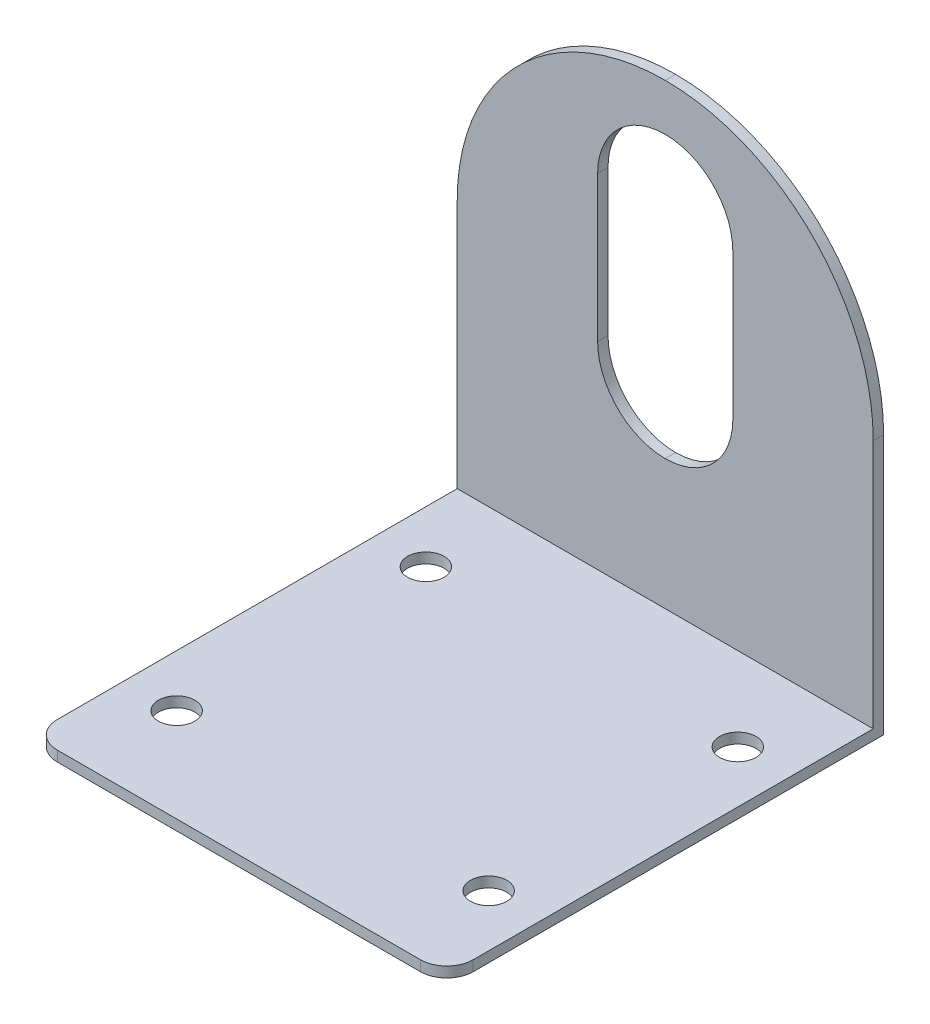
ISO-10303-21;
HEADER;
FILE_DESCRIPTION(('STEP AP214'),'2;1');
FILE_NAME('part.step','',(''),(''),'','','');
FILE_SCHEMA(('AUTOMOTIVE_DESIGN { 1 0 10303 214 1 1 1 1 }'));
ENDSEC;
DATA;
#1=APPLICATION_CONTEXT('core data for automotive mechanical design processes');
#2=APPLICATION_PROTOCOL_DEFINITION('international standard','automotive_design',2000,#1);
#3=PRODUCT_CONTEXT('',#1,'mechanical');
#4=PRODUCT('Part','Part','',(#3));
#5=PRODUCT_RELATED_PRODUCT_CATEGORY('part','',(#4));
#6=PRODUCT_DEFINITION_FORMATION('','',#4);
#7=PRODUCT_DEFINITION_CONTEXT('part definition',#1,'design');
#8=PRODUCT_DEFINITION('design','',#6,#7);
#9=PRODUCT_DEFINITION_SHAPE('','',#8);
#10=(LENGTH_UNIT() NAMED_UNIT(*) SI_UNIT(.MILLI.,.METRE.));
#11=(NAMED_UNIT(*) PLANE_ANGLE_UNIT() SI_UNIT($,.RADIAN.));
#12=(NAMED_UNIT(*) SI_UNIT($,.STERADIAN.) SOLID_ANGLE_UNIT());
#13=UNCERTAINTY_MEASURE_WITH_UNIT(LENGTH_MEASURE(1.E-05),#10,'distance_accuracy_value','');
#14=(GEOMETRIC_REPRESENTATION_CONTEXT(3) GLOBAL_UNCERTAINTY_ASSIGNED_CONTEXT((#13)) GLOBAL_UNIT_ASSIGNED_CONTEXT((#10,
#11,#12)) REPRESENTATION_CONTEXT('',''));
#15=CARTESIAN_POINT('',(0.,0.,0.));
#16=DIRECTION('',(0.,0.,1.));
#17=DIRECTION('',(1.,0.,0.));
#18=AXIS2_PLACEMENT_3D('',#15,#16,#17);
#19=CARTESIAN_POINT('',(20.,20.,42.));
#20=DIRECTION('',(0.,0.,1.));
#21=DIRECTION('',(1.,0.,0.));
#22=AXIS2_PLACEMENT_3D('',#19,#20,#21);
#23=CYLINDRICAL_SURFACE('',#22,6.5);
#24=DIRECTION('',(0.,0.,-1.));
#25=VECTOR('',#24,1.);
#26=CARTESIAN_POINT('',(26.5,20.,42.));
#27=LINE('',#26,#25);
#28=CARTESIAN_POINT('',(26.5,20.,0.));
#29=VERTEX_POINT('',#28);
#30=CARTESIAN_POINT('',(26.5,20.,1.));
#31=VERTEX_POINT('',#30);
#32=EDGE_CURVE('E251',#29,#31,#27,.F.);
#33=ORIENTED_EDGE('',*,*,#32,.F.);
#34=CARTESIAN_POINT('',(20.,20.,0.));
#35=DIRECTION('',(0.,0.,-1.));
#36=DIRECTION('',(-1.,0.,0.));
#37=AXIS2_PLACEMENT_3D('',#34,#35,#36);
#38=CIRCLE('',#37,6.5);
#39=CARTESIAN_POINT('',(20.,13.5,0.));
#40=VERTEX_POINT('',#39);
#41=EDGE_CURVE('E11',#29,#40,#38,.T.);
#42=ORIENTED_EDGE('',*,*,#41,.T.);
#43=DIRECTION('',(0.,0.,-1.));
#44=VECTOR('',#43,1.);
#45=CARTESIAN_POINT('',(20.,13.5,42.));
#46=LINE('',#45,#44);
#47=CARTESIAN_POINT('',(20.,13.5,1.));
#48=VERTEX_POINT('',#47);
#49=EDGE_CURVE('E244',#40,#48,#46,.F.);
#50=ORIENTED_EDGE('',*,*,#49,.T.);
#51=CARTESIAN_POINT('',(20.,20.,1.));
#52=DIRECTION('',(0.,0.,-1.));
#53=DIRECTION('',(-1.,0.,0.));
#54=AXIS2_PLACEMENT_3D('',#51,#52,#53);
#55=CIRCLE('',#54,6.5);
#56=EDGE_CURVE('E40',#48,#31,#55,.F.);
#57=ORIENTED_EDGE('',*,*,#56,.T.);
#58=EDGE_LOOP('',(#33,#42,#50,#57));
#59=FACE_BOUND('',#58,.T.);
#60=ADVANCED_FACE('F33',(#59),#23,.F.);
#61=CARTESIAN_POINT('',(20.,20.,42.));
#62=DIRECTION('',(0.,0.,1.));
#63=DIRECTION('',(1.,0.,0.));
#64=AXIS2_PLACEMENT_3D('',#61,#62,#63);
#65=CYLINDRICAL_SURFACE('',#64,6.5);
#66=DIRECTION('',(0.,0.,-1.));
#67=VECTOR('',#66,1.);
#68=CARTESIAN_POINT('',(13.5,20.,42.));
#69=LINE('',#68,#67);
#70=CARTESIAN_POINT('',(13.5,20.,1.));
#71=VERTEX_POINT('',#70);
#72=CARTESIAN_POINT('',(13.5,20.,0.));
#73=VERTEX_POINT('',#72);
#74=EDGE_CURVE('E241',#71,#73,#69,.T.);
#75=ORIENTED_EDGE('',*,*,#74,.F.);
#76=CARTESIAN_POINT('',(20.,20.,1.));
#77=DIRECTION('',(0.,0.,-1.));
#78=DIRECTION('',(-1.,0.,0.));
#79=AXIS2_PLACEMENT_3D('',#76,#77,#78);
#80=CIRCLE('',#79,6.5);
#81=EDGE_CURVE('E246',#71,#48,#80,.F.);
#82=ORIENTED_EDGE('',*,*,#81,.T.);
#83=ORIENTED_EDGE('',*,*,#49,.F.);
#84=CARTESIAN_POINT('',(20.,20.,0.));
#85=DIRECTION('',(0.,0.,-1.));
#86=DIRECTION('',(-1.,0.,0.));
#87=AXIS2_PLACEMENT_3D('',#84,#85,#86);
#88=CIRCLE('',#87,6.5);
#89=EDGE_CURVE('E249',#40,#73,#88,.T.);
#90=ORIENTED_EDGE('',*,*,#89,.T.);
#91=EDGE_LOOP('',(#75,#82,#83,#90));
#92=FACE_BOUND('',#91,.T.);
#93=ADVANCED_FACE('F309',(#92),#65,.F.);
#94=CARTESIAN_POINT('',(20.,34.,42.));
#95=DIRECTION('',(0.,0.,-1.));
#96=DIRECTION('',(-1.,0.,0.));
#97=AXIS2_PLACEMENT_3D('',#94,#95,#96);
#98=CYLINDRICAL_SURFACE('',#97,6.5);
#99=DIRECTION('',(0.,0.,1.));
#100=VECTOR('',#99,1.);
#101=CARTESIAN_POINT('',(26.5,34.,42.));
#102=LINE('',#101,#100);
#103=CARTESIAN_POINT('',(26.5,34.,1.));
#104=VERTEX_POINT('',#103);
#105=CARTESIAN_POINT('',(26.5,34.,0.));
#106=VERTEX_POINT('',#105);
#107=EDGE_CURVE('E234',#104,#106,#102,.F.);
#108=ORIENTED_EDGE('',*,*,#107,.F.);
#109=CARTESIAN_POINT('',(20.,34.,1.));
#110=DIRECTION('',(0.,0.,-1.));
#111=DIRECTION('',(-1.,0.,0.));
#112=AXIS2_PLACEMENT_3D('',#109,#110,#111);
#113=CIRCLE('',#112,6.5);
#114=CARTESIAN_POINT('',(20.,40.5,1.));
#115=VERTEX_POINT('',#114);
#116=EDGE_CURVE('E239',#104,#115,#113,.F.);
#117=ORIENTED_EDGE('',*,*,#116,.T.);
#118=DIRECTION('',(0.,0.,-1.));
#119=VECTOR('',#118,1.);
#120=CARTESIAN_POINT('',(20.,40.5,42.));
#121=LINE('',#120,#119);
#122=CARTESIAN_POINT('',(20.,40.5,0.));
#123=VERTEX_POINT('',#122);
#124=EDGE_CURVE('E222',#115,#123,#121,.T.);
#125=ORIENTED_EDGE('',*,*,#124,.T.);
#126=CARTESIAN_POINT('',(20.,34.,0.));
#127=DIRECTION('',(0.,0.,-1.));
#128=DIRECTION('',(-1.,0.,0.));
#129=AXIS2_PLACEMENT_3D('',#126,#127,#128);
#130=CIRCLE('',#129,6.5);
#131=EDGE_CURVE('E237',#123,#106,#130,.T.);
#132=ORIENTED_EDGE('',*,*,#131,.T.);
#133=EDGE_LOOP('',(#108,#117,#125,#132));
#134=FACE_BOUND('',#133,.T.);
#135=ADVANCED_FACE('F313',(#134),#98,.F.);
#136=CARTESIAN_POINT('',(20.,34.,42.));
#137=DIRECTION('',(0.,0.,1.));
#138=DIRECTION('',(1.,0.,0.));
#139=AXIS2_PLACEMENT_3D('',#136,#137,#138);
#140=CYLINDRICAL_SURFACE('',#139,6.5);
#141=ORIENTED_EDGE('',*,*,#124,.F.);
#142=CARTESIAN_POINT('',(20.,34.,1.));
#143=DIRECTION('',(0.,0.,-1.));
#144=DIRECTION('',(-1.,0.,0.));
#145=AXIS2_PLACEMENT_3D('',#142,#143,#144);
#146=CIRCLE('',#145,6.5);
#147=CARTESIAN_POINT('',(13.5,34.,1.));
#148=VERTEX_POINT('',#147);
#149=EDGE_CURVE('E228',#115,#148,#146,.F.);
#150=ORIENTED_EDGE('',*,*,#149,.T.);
#151=DIRECTION('',(0.,0.,-1.));
#152=VECTOR('',#151,1.);
#153=CARTESIAN_POINT('',(13.5,34.,42.));
#154=LINE('',#153,#152);
#155=CARTESIAN_POINT('',(13.5,34.,0.));
#156=VERTEX_POINT('',#155);
#157=EDGE_CURVE('E225',#156,#148,#154,.F.);
#158=ORIENTED_EDGE('',*,*,#157,.F.);
#159=CARTESIAN_POINT('',(20.,34.,0.));
#160=DIRECTION('',(0.,0.,-1.));
#161=DIRECTION('',(-1.,0.,0.));
#162=AXIS2_PLACEMENT_3D('',#159,#160,#161);
#163=CIRCLE('',#162,6.5);
#164=EDGE_CURVE('E231',#156,#123,#163,.T.);
#165=ORIENTED_EDGE('',*,*,#164,.T.);
#166=EDGE_LOOP('',(#141,#150,#158,#165));
#167=FACE_BOUND('',#166,.T.);
#168=ADVANCED_FACE('F318',(#167),#140,.F.);
#169=CARTESIAN_POINT('',(2.54,0.,39.46));
#170=DIRECTION('',(0.,1.,0.));
#171=DIRECTION('',(0.,0.,1.));
#172=AXIS2_PLACEMENT_3D('',#169,#170,#171);
#173=CYLINDRICAL_SURFACE('',#172,2.54);
#174=DIRECTION('',(0.,1.,0.));
#175=VECTOR('',#174,1.);
#176=CARTESIAN_POINT('',(0.,0.,39.46));
#177=LINE('',#176,#175);
#178=CARTESIAN_POINT('',(0.,0.,39.46));
#179=VERTEX_POINT('',#178);
#180=CARTESIAN_POINT('',(0.,1.,39.46));
#181=VERTEX_POINT('',#180);
#182=EDGE_CURVE('E145',#179,#181,#177,.T.);
#183=ORIENTED_EDGE('',*,*,#182,.F.);
#184=CARTESIAN_POINT('',(2.54,0.,39.46));
#185=DIRECTION('',(0.,1.,0.));
#186=DIRECTION('',(0.,0.,1.));
#187=AXIS2_PLACEMENT_3D('',#184,#185,#186);
#188=CIRCLE('',#187,2.54);
#189=CARTESIAN_POINT('',(2.54,0.,42.));
#190=VERTEX_POINT('',#189);
#191=EDGE_CURVE('E218',#190,#179,#188,.F.);
#192=ORIENTED_EDGE('',*,*,#191,.F.);
#193=DIRECTION('',(0.,1.,0.));
#194=VECTOR('',#193,1.);
#195=CARTESIAN_POINT('',(2.54,0.,42.));
#196=LINE('',#195,#194);
#197=CARTESIAN_POINT('',(2.54,1.,42.));
#198=VERTEX_POINT('',#197);
#199=EDGE_CURVE('E215',#198,#190,#196,.F.);
#200=ORIENTED_EDGE('',*,*,#199,.F.);
#201=CARTESIAN_POINT('',(2.54,1.,39.46));
#202=DIRECTION('',(0.,-1.,0.));
#203=DIRECTION('',(0.,0.,-1.));
#204=AXIS2_PLACEMENT_3D('',#201,#202,#203);
#205=CIRCLE('',#204,2.54);
#206=EDGE_CURVE('E220',#181,#198,#205,.F.);
#207=ORIENTED_EDGE('',*,*,#206,.F.);
#208=EDGE_LOOP('',(#183,#192,#200,#207));
#209=FACE_BOUND('',#208,.T.);
#210=ADVANCED_FACE('F325',(#209),#173,.T.);
#211=CARTESIAN_POINT('',(37.46,0.,39.46));
#212=DIRECTION('',(0.,-1.,0.));
#213=DIRECTION('',(0.,0.,-1.));
#214=AXIS2_PLACEMENT_3D('',#211,#212,#213);
#215=CYLINDRICAL_SURFACE('',#214,2.54);
#216=DIRECTION('',(0.,-1.,0.));
#217=VECTOR('',#216,1.);
#218=CARTESIAN_POINT('',(40.,0.,39.46));
#219=LINE('',#218,#217);
#220=CARTESIAN_POINT('',(40.,1.,39.46));
#221=VERTEX_POINT('',#220);
#222=CARTESIAN_POINT('',(40.,0.,39.46));
#223=VERTEX_POINT('',#222);
#224=EDGE_CURVE('E203',#221,#223,#219,.T.);
#225=ORIENTED_EDGE('',*,*,#224,.F.);
#226=CARTESIAN_POINT('',(37.46,1.,39.46));
#227=DIRECTION('',(0.,-1.,0.));
#228=DIRECTION('',(0.,0.,-1.));
#229=AXIS2_PLACEMENT_3D('',#226,#227,#228);
#230=CIRCLE('',#229,2.54);
#231=CARTESIAN_POINT('',(37.46,1.,42.));
#232=VERTEX_POINT('',#231);
#233=EDGE_CURVE('E209',#232,#221,#230,.F.);
#234=ORIENTED_EDGE('',*,*,#233,.F.);
#235=DIRECTION('',(0.,-1.,0.));
#236=VECTOR('',#235,1.);
#237=CARTESIAN_POINT('',(37.46,0.,42.));
#238=LINE('',#237,#236);
#239=CARTESIAN_POINT('',(37.46,0.,42.));
#240=VERTEX_POINT('',#239);
#241=EDGE_CURVE('E206',#240,#232,#238,.F.);
#242=ORIENTED_EDGE('',*,*,#241,.F.);
#243=CARTESIAN_POINT('',(37.46,0.,39.46));
#244=DIRECTION('',(0.,1.,0.));
#245=DIRECTION('',(0.,0.,1.));
#246=AXIS2_PLACEMENT_3D('',#243,#244,#245);
#247=CIRCLE('',#246,2.54);
#248=EDGE_CURVE('E211',#223,#240,#247,.F.);
#249=ORIENTED_EDGE('',*,*,#248,.F.);
#250=EDGE_LOOP('',(#225,#234,#242,#249));
#251=FACE_BOUND('',#250,.T.);
#252=ADVANCED_FACE('F329',(#251),#215,.T.);
#253=CARTESIAN_POINT('',(0.,0.,1.));
#254=DIRECTION('',(0.,0.,-1.));
#255=DIRECTION('',(-1.,0.,0.));
#256=AXIS2_PLACEMENT_3D('',#253,#254,#255);
#257=PLANE('',#256);
#258=ORIENTED_EDGE('',*,*,#56,.F.);
#259=ORIENTED_EDGE('',*,*,#81,.F.);
#260=DIRECTION('',(0.,1.,0.));
#261=VECTOR('',#260,1.);
#262=CARTESIAN_POINT('',(13.5,0.,1.));
#263=LINE('',#262,#261);
#264=EDGE_CURVE('E262',#71,#148,#263,.T.);
#265=ORIENTED_EDGE('',*,*,#264,.T.);
#266=ORIENTED_EDGE('',*,*,#149,.F.);
#267=ORIENTED_EDGE('',*,*,#116,.F.);
#268=DIRECTION('',(0.,-1.,0.));
#269=VECTOR('',#268,1.);
#270=CARTESIAN_POINT('',(26.5,0.,1.));
#271=LINE('',#270,#269);
#272=EDGE_CURVE('E257',#104,#31,#271,.T.);
#273=ORIENTED_EDGE('',*,*,#272,.T.);
#274=EDGE_LOOP('',(#258,#259,#265,#266,#267,#273));
#275=FACE_BOUND('',#274,.T.);
#276=DIRECTION('',(-1.,0.,0.));
#277=VECTOR('',#276,1.);
#278=CARTESIAN_POINT('',(0.,1.,1.));
#279=LINE('',#278,#277);
#280=CARTESIAN_POINT('',(40.,1.,1.));
#281=VERTEX_POINT('',#280);
#282=CARTESIAN_POINT('',(0.,1.,1.));
#283=VERTEX_POINT('',#282);
#284=EDGE_CURVE('E154',#281,#283,#279,.T.);
#285=ORIENTED_EDGE('',*,*,#284,.F.);
#286=DIRECTION('',(0.,1.,0.));
#287=VECTOR('',#286,1.);
#288=CARTESIAN_POINT('',(40.,0.,1.));
#289=LINE('',#288,#287);
#290=CARTESIAN_POINT('',(40.,24.999999916,1.));
#291=VERTEX_POINT('',#290);
#292=EDGE_CURVE('E159',#281,#291,#289,.T.);
#293=ORIENTED_EDGE('',*,*,#292,.T.);
#294=CARTESIAN_POINT('',(20.,24.999999916,1.));
#295=DIRECTION('',(0.,0.,-1.));
#296=DIRECTION('',(-1.,0.,0.));
#297=AXIS2_PLACEMENT_3D('',#294,#295,#296);
#298=CIRCLE('',#297,20.);
#299=CARTESIAN_POINT('',(20.,44.999999916,1.));
#300=VERTEX_POINT('',#299);
#301=EDGE_CURVE('E199',#291,#300,#298,.F.);
#302=ORIENTED_EDGE('',*,*,#301,.T.);
#303=CARTESIAN_POINT('',(20.,24.999999916,1.));
#304=DIRECTION('',(0.,0.,-1.));
#305=DIRECTION('',(-1.,0.,0.));
#306=AXIS2_PLACEMENT_3D('',#303,#304,#305);
#307=CIRCLE('',#306,20.);
#308=CARTESIAN_POINT('',(0.,24.999999916,1.));
#309=VERTEX_POINT('',#308);
#310=EDGE_CURVE('E157',#300,#309,#307,.F.);
#311=ORIENTED_EDGE('',*,*,#310,.T.);
#312=DIRECTION('',(0.,-1.,0.));
#313=VECTOR('',#312,1.);
#314=CARTESIAN_POINT('',(0.,0.,1.));
#315=LINE('',#314,#313);
#316=EDGE_CURVE('E143',#309,#283,#315,.T.);
#317=ORIENTED_EDGE('',*,*,#316,.T.);
#318=EDGE_LOOP('',(#285,#293,#302,#311,#317));
#319=FACE_BOUND('',#318,.T.);
#320=ADVANCED_FACE('F153',(#275,#319),#257,.F.);
#321=CARTESIAN_POINT('',(20.,24.999999916,1.));
#322=DIRECTION('',(0.,0.,-1.));
#323=DIRECTION('',(-1.,0.,0.));
#324=AXIS2_PLACEMENT_3D('',#321,#322,#323);
#325=CYLINDRICAL_SURFACE('',#324,20.);
#326=DIRECTION('',(0.,0.,-1.));
#327=VECTOR('',#326,1.);
#328=CARTESIAN_POINT('',(20.,44.999999916,1.));
#329=LINE('',#328,#327);
#330=CARTESIAN_POINT('',(20.,44.999999916,0.));
#331=VERTEX_POINT('',#330);
#332=EDGE_CURVE('E189',#331,#300,#329,.F.);
#333=ORIENTED_EDGE('',*,*,#332,.T.);
#334=ORIENTED_EDGE('',*,*,#301,.F.);
#335=DIRECTION('',(0.,0.,-1.));
#336=VECTOR('',#335,1.);
#337=CARTESIAN_POINT('',(40.,24.999999916,1.));
#338=LINE('',#337,#336);
#339=CARTESIAN_POINT('',(40.,24.999999916,0.));
#340=VERTEX_POINT('',#339);
#341=EDGE_CURVE('E196',#340,#291,#338,.F.);
#342=ORIENTED_EDGE('',*,*,#341,.F.);
#343=CARTESIAN_POINT('',(20.,24.999999916,0.));
#344=DIRECTION('',(0.,0.,-1.));
#345=DIRECTION('',(-1.,0.,0.));
#346=AXIS2_PLACEMENT_3D('',#343,#344,#345);
#347=CIRCLE('',#346,20.);
#348=EDGE_CURVE('E201',#331,#340,#347,.T.);
#349=ORIENTED_EDGE('',*,*,#348,.F.);
#350=EDGE_LOOP('',(#333,#334,#342,#349));
#351=FACE_BOUND('',#350,.T.);
#352=ADVANCED_FACE('F334',(#351),#325,.T.);
#353=CARTESIAN_POINT('',(20.,24.999999916,1.));
#354=DIRECTION('',(0.,0.,-1.));
#355=DIRECTION('',(-1.,0.,0.));
#356=AXIS2_PLACEMENT_3D('',#353,#354,#355);
#357=CYLINDRICAL_SURFACE('',#356,20.);
#358=DIRECTION('',(0.,0.,-1.));
#359=VECTOR('',#358,1.);
#360=CARTESIAN_POINT('',(0.,24.999999916,1.));
#361=LINE('',#360,#359);
#362=CARTESIAN_POINT('',(0.,24.999999916,0.));
#363=VERTEX_POINT('',#362);
#364=EDGE_CURVE('E187',#309,#363,#361,.T.);
#365=ORIENTED_EDGE('',*,*,#364,.F.);
#366=ORIENTED_EDGE('',*,*,#310,.F.);
#367=ORIENTED_EDGE('',*,*,#332,.F.);
#368=CARTESIAN_POINT('',(20.,24.999999916,0.));
#369=DIRECTION('',(0.,0.,-1.));
#370=DIRECTION('',(-1.,0.,0.));
#371=AXIS2_PLACEMENT_3D('',#368,#369,#370);
#372=CIRCLE('',#371,20.);
#373=EDGE_CURVE('E193',#363,#331,#372,.T.);
#374=ORIENTED_EDGE('',*,*,#373,.F.);
#375=EDGE_LOOP('',(#365,#366,#367,#374));
#376=FACE_BOUND('',#375,.T.);
#377=ADVANCED_FACE('F337',(#376),#357,.T.);
#378=CARTESIAN_POINT('',(0.,0.,1.));
#379=DIRECTION('',(1.,0.,0.));
#380=DIRECTION('',(0.,0.,-1.));
#381=AXIS2_PLACEMENT_3D('',#378,#379,#380);
#382=PLANE('',#381);
#383=DIRECTION('',(0.,0.,-1.));
#384=VECTOR('',#383,1.);
#385=CARTESIAN_POINT('',(0.,0.,1.));
#386=LINE('',#385,#384);
#387=CARTESIAN_POINT('',(0.,0.,0.));
#388=VERTEX_POINT('',#387);
#389=EDGE_CURVE('E185',#179,#388,#386,.T.);
#390=ORIENTED_EDGE('',*,*,#389,.F.);
#391=ORIENTED_EDGE('',*,*,#182,.T.);
#392=DIRECTION('',(0.,0.,-1.));
#393=VECTOR('',#392,1.);
#394=CARTESIAN_POINT('',(0.,1.,42.));
#395=LINE('',#394,#393);
#396=EDGE_CURVE('E138',#181,#283,#395,.T.);
#397=ORIENTED_EDGE('',*,*,#396,.T.);
#398=ORIENTED_EDGE('',*,*,#316,.F.);
#399=ORIENTED_EDGE('',*,*,#364,.T.);
#400=DIRECTION('',(0.,-1.,0.));
#401=VECTOR('',#400,1.);
#402=CARTESIAN_POINT('',(0.,0.,0.));
#403=LINE('',#402,#401);
#404=EDGE_CURVE('E173',#363,#388,#403,.T.);
#405=ORIENTED_EDGE('',*,*,#404,.T.);
#406=EDGE_LOOP('',(#390,#391,#397,#398,#399,#405));
#407=FACE_BOUND('',#406,.T.);
#408=ADVANCED_FACE('F141',(#407),#382,.F.);
#409=CARTESIAN_POINT('',(0.,0.,1.));
#410=DIRECTION('',(0.,1.,0.));
#411=DIRECTION('',(0.,0.,1.));
#412=AXIS2_PLACEMENT_3D('',#409,#410,#411);
#413=PLANE('',#412);
#414=CARTESIAN_POINT('',(35.,0.,9.02029299449192));
#415=DIRECTION('',(0.,1.,0.));
#416=DIRECTION('',(0.,0.,1.));
#417=AXIS2_PLACEMENT_3D('',#414,#415,#416);
#418=CIRCLE('',#417,1.75);
#419=CARTESIAN_POINT('',(35.,0.,10.7702929944919));
#420=VERTEX_POINT('',#419);
#421=EDGE_CURVE('E282',#420,#420,#418,.T.);
#422=ORIENTED_EDGE('',*,*,#421,.T.);
#423=EDGE_LOOP('',(#422));
#424=FACE_BOUND('',#423,.T.);
#425=CARTESIAN_POINT('',(5.,0.,9.02029299449192));
#426=DIRECTION('',(0.,1.,0.));
#427=DIRECTION('',(0.,0.,1.));
#428=AXIS2_PLACEMENT_3D('',#425,#426,#427);
#429=CIRCLE('',#428,1.75);
#430=CARTESIAN_POINT('',(5.,0.,10.7702929944919));
#431=VERTEX_POINT('',#430);
#432=EDGE_CURVE('E276',#431,#431,#429,.T.);
#433=ORIENTED_EDGE('',*,*,#432,.T.);
#434=EDGE_LOOP('',(#433));
#435=FACE_BOUND('',#434,.T.);
#436=CARTESIAN_POINT('',(5.,0.,32.9797070055081));
#437=DIRECTION('',(0.,1.,0.));
#438=DIRECTION('',(0.,0.,1.));
#439=AXIS2_PLACEMENT_3D('',#436,#437,#438);
#440=CIRCLE('',#439,1.75);
#441=CARTESIAN_POINT('',(5.,0.,34.7297070055081));
#442=VERTEX_POINT('',#441);
#443=EDGE_CURVE('E270',#442,#442,#440,.T.);
#444=ORIENTED_EDGE('',*,*,#443,.T.);
#445=EDGE_LOOP('',(#444));
#446=FACE_BOUND('',#445,.T.);
#447=CARTESIAN_POINT('',(35.,0.,32.9797070055081));
#448=DIRECTION('',(0.,1.,0.));
#449=DIRECTION('',(0.,0.,1.));
#450=AXIS2_PLACEMENT_3D('',#447,#448,#449);
#451=CIRCLE('',#450,1.75);
#452=CARTESIAN_POINT('',(35.,0.,34.7297070055081));
#453=VERTEX_POINT('',#452);
#454=EDGE_CURVE('E165',#453,#453,#451,.T.);
#455=ORIENTED_EDGE('',*,*,#454,.T.);
#456=EDGE_LOOP('',(#455));
#457=FACE_BOUND('',#456,.T.);
#458=DIRECTION('',(1.,0.,0.));
#459=VECTOR('',#458,1.);
#460=CARTESIAN_POINT('',(0.,0.,42.));
#461=LINE('',#460,#459);
#462=EDGE_CURVE('E164',#190,#240,#461,.T.);
#463=ORIENTED_EDGE('',*,*,#462,.F.);
#464=ORIENTED_EDGE('',*,*,#191,.T.);
#465=ORIENTED_EDGE('',*,*,#389,.T.);
#466=DIRECTION('',(1.,0.,0.));
#467=VECTOR('',#466,1.);
#468=CARTESIAN_POINT('',(0.,0.,0.));
#469=LINE('',#468,#467);
#470=CARTESIAN_POINT('',(40.,0.,0.));
#471=VERTEX_POINT('',#470);
#472=EDGE_CURVE('E179',#388,#471,#469,.T.);
#473=ORIENTED_EDGE('',*,*,#472,.T.);
#474=DIRECTION('',(0.,0.,-1.));
#475=VECTOR('',#474,1.);
#476=CARTESIAN_POINT('',(40.,0.,1.));
#477=LINE('',#476,#475);
#478=EDGE_CURVE('E176',#223,#471,#477,.T.);
#479=ORIENTED_EDGE('',*,*,#478,.F.);
#480=ORIENTED_EDGE('',*,*,#248,.T.);
#481=EDGE_LOOP('',(#463,#464,#465,#473,#479,#480));
#482=FACE_BOUND('',#481,.T.);
#483=ADVANCED_FACE('F344',(#424,#435,#446,#457,#482),#413,.F.);
#484=CARTESIAN_POINT('',(40.,0.,1.));
#485=DIRECTION('',(-1.,0.,0.));
#486=DIRECTION('',(0.,0.,1.));
#487=AXIS2_PLACEMENT_3D('',#484,#485,#486);
#488=PLANE('',#487);
#489=DIRECTION('',(0.,0.,-1.));
#490=VECTOR('',#489,1.);
#491=CARTESIAN_POINT('',(40.,1.,42.));
#492=LINE('',#491,#490);
#493=EDGE_CURVE('E148',#221,#281,#492,.T.);
#494=ORIENTED_EDGE('',*,*,#493,.F.);
#495=ORIENTED_EDGE('',*,*,#224,.T.);
#496=ORIENTED_EDGE('',*,*,#478,.T.);
#497=DIRECTION('',(0.,1.,0.));
#498=VECTOR('',#497,1.);
#499=CARTESIAN_POINT('',(40.,0.,0.));
#500=LINE('',#499,#498);
#501=EDGE_CURVE('E160',#471,#340,#500,.T.);
#502=ORIENTED_EDGE('',*,*,#501,.T.);
#503=ORIENTED_EDGE('',*,*,#341,.T.);
#504=ORIENTED_EDGE('',*,*,#292,.F.);
#505=EDGE_LOOP('',(#494,#495,#496,#502,#503,#504));
#506=FACE_BOUND('',#505,.T.);
#507=ADVANCED_FACE('F303',(#506),#488,.F.);
#508=CARTESIAN_POINT('',(0.,0.,0.));
#509=DIRECTION('',(0.,0.,-1.));
#510=DIRECTION('',(-1.,0.,0.));
#511=AXIS2_PLACEMENT_3D('',#508,#509,#510);
#512=PLANE('',#511);
#513=DIRECTION('',(0.,1.,0.));
#514=VECTOR('',#513,1.);
#515=CARTESIAN_POINT('',(13.5,13.5,0.));
#516=LINE('',#515,#514);
#517=EDGE_CURVE('E266',#73,#156,#516,.T.);
#518=ORIENTED_EDGE('',*,*,#517,.F.);
#519=ORIENTED_EDGE('',*,*,#89,.F.);
#520=ORIENTED_EDGE('',*,*,#41,.F.);
#521=DIRECTION('',(0.,-1.,0.));
#522=VECTOR('',#521,1.);
#523=CARTESIAN_POINT('',(26.5,13.5,0.));
#524=LINE('',#523,#522);
#525=EDGE_CURVE('E258',#106,#29,#524,.T.);
#526=ORIENTED_EDGE('',*,*,#525,.F.);
#527=ORIENTED_EDGE('',*,*,#131,.F.);
#528=ORIENTED_EDGE('',*,*,#164,.F.);
#529=EDGE_LOOP('',(#518,#519,#520,#526,#527,#528));
#530=FACE_BOUND('',#529,.T.);
#531=ORIENTED_EDGE('',*,*,#373,.T.);
#532=ORIENTED_EDGE('',*,*,#348,.T.);
#533=ORIENTED_EDGE('',*,*,#501,.F.);
#534=ORIENTED_EDGE('',*,*,#472,.F.);
#535=ORIENTED_EDGE('',*,*,#404,.F.);
#536=EDGE_LOOP('',(#531,#532,#533,#534,#535));
#537=FACE_BOUND('',#536,.T.);
#538=ADVANCED_FACE('F294',(#530,#537),#512,.T.);
#539=CARTESIAN_POINT('',(0.,1.,42.));
#540=DIRECTION('',(0.,-1.,0.));
#541=DIRECTION('',(0.,0.,-1.));
#542=AXIS2_PLACEMENT_3D('',#539,#540,#541);
#543=PLANE('',#542);
#544=CARTESIAN_POINT('',(35.,1.,9.02029299449192));
#545=DIRECTION('',(0.,1.,0.));
#546=DIRECTION('',(0.,0.,1.));
#547=AXIS2_PLACEMENT_3D('',#544,#545,#546);
#548=CIRCLE('',#547,1.75);
#549=CARTESIAN_POINT('',(35.,1.,10.7702929944919));
#550=VERTEX_POINT('',#549);
#551=EDGE_CURVE('E264',#550,#550,#548,.T.);
#552=ORIENTED_EDGE('',*,*,#551,.F.);
#553=EDGE_LOOP('',(#552));
#554=FACE_BOUND('',#553,.T.);
#555=CARTESIAN_POINT('',(5.,1.,9.02029299449192));
#556=DIRECTION('',(0.,1.,0.));
#557=DIRECTION('',(0.,0.,1.));
#558=AXIS2_PLACEMENT_3D('',#555,#556,#557);
#559=CIRCLE('',#558,1.75);
#560=CARTESIAN_POINT('',(5.,1.,10.7702929944919));
#561=VERTEX_POINT('',#560);
#562=EDGE_CURVE('E279',#561,#561,#559,.T.);
#563=ORIENTED_EDGE('',*,*,#562,.F.);
#564=EDGE_LOOP('',(#563));
#565=FACE_BOUND('',#564,.T.);
#566=CARTESIAN_POINT('',(5.,1.,32.9797070055081));
#567=DIRECTION('',(0.,1.,0.));
#568=DIRECTION('',(0.,0.,1.));
#569=AXIS2_PLACEMENT_3D('',#566,#567,#568);
#570=CIRCLE('',#569,1.75);
#571=CARTESIAN_POINT('',(5.,1.,34.7297070055081));
#572=VERTEX_POINT('',#571);
#573=EDGE_CURVE('E273',#572,#572,#570,.T.);
#574=ORIENTED_EDGE('',*,*,#573,.F.);
#575=EDGE_LOOP('',(#574));
#576=FACE_BOUND('',#575,.T.);
#577=CARTESIAN_POINT('',(35.,1.,32.9797070055081));
#578=DIRECTION('',(0.,1.,0.));
#579=DIRECTION('',(0.,0.,1.));
#580=AXIS2_PLACEMENT_3D('',#577,#578,#579);
#581=CIRCLE('',#580,1.75);
#582=CARTESIAN_POINT('',(35.,1.,34.7297070055081));
#583=VERTEX_POINT('',#582);
#584=EDGE_CURVE('E169',#583,#583,#581,.T.);
#585=ORIENTED_EDGE('',*,*,#584,.F.);
#586=EDGE_LOOP('',(#585));
#587=FACE_BOUND('',#586,.T.);
#588=ORIENTED_EDGE('',*,*,#396,.F.);
#589=ORIENTED_EDGE('',*,*,#206,.T.);
#590=DIRECTION('',(-1.,0.,0.));
#591=VECTOR('',#590,1.);
#592=CARTESIAN_POINT('',(0.,1.,42.));
#593=LINE('',#592,#591);
#594=EDGE_CURVE('E149',#232,#198,#593,.T.);
#595=ORIENTED_EDGE('',*,*,#594,.F.);
#596=ORIENTED_EDGE('',*,*,#233,.T.);
#597=ORIENTED_EDGE('',*,*,#493,.T.);
#598=ORIENTED_EDGE('',*,*,#284,.T.);
#599=EDGE_LOOP('',(#588,#589,#595,#596,#597,#598));
#600=FACE_BOUND('',#599,.T.);
#601=ADVANCED_FACE('F162',(#554,#565,#576,#587,#600),#543,.F.);
#602=CARTESIAN_POINT('',(0.,0.,42.));
#603=DIRECTION('',(0.,0.,-1.));
#604=DIRECTION('',(-1.,0.,0.));
#605=AXIS2_PLACEMENT_3D('',#602,#603,#604);
#606=PLANE('',#605);
#607=ORIENTED_EDGE('',*,*,#594,.T.);
#608=ORIENTED_EDGE('',*,*,#199,.T.);
#609=ORIENTED_EDGE('',*,*,#462,.T.);
#610=ORIENTED_EDGE('',*,*,#241,.T.);
#611=EDGE_LOOP('',(#607,#608,#609,#610));
#612=FACE_BOUND('',#611,.T.);
#613=ADVANCED_FACE('F293',(#612),#606,.F.);
#614=CARTESIAN_POINT('',(35.,0.,32.9797070055081));
#615=DIRECTION('',(0.,1.,0.));
#616=DIRECTION('',(0.,0.,1.));
#617=AXIS2_PLACEMENT_3D('',#614,#615,#616);
#618=CYLINDRICAL_SURFACE('',#617,1.75);
#619=ORIENTED_EDGE('',*,*,#454,.F.);
#620=EDGE_LOOP('',(#619));
#621=FACE_BOUND('',#620,.T.);
#622=ORIENTED_EDGE('',*,*,#584,.T.);
#623=EDGE_LOOP('',(#622));
#624=FACE_BOUND('',#623,.T.);
#625=ADVANCED_FACE('F290',(#621,#624),#618,.F.);
#626=CARTESIAN_POINT('',(5.,0.,32.9797070055081));
#627=DIRECTION('',(0.,1.,0.));
#628=DIRECTION('',(0.,0.,1.));
#629=AXIS2_PLACEMENT_3D('',#626,#627,#628);
#630=CYLINDRICAL_SURFACE('',#629,1.75);
#631=ORIENTED_EDGE('',*,*,#443,.F.);
#632=EDGE_LOOP('',(#631));
#633=FACE_BOUND('',#632,.T.);
#634=ORIENTED_EDGE('',*,*,#573,.T.);
#635=EDGE_LOOP('',(#634));
#636=FACE_BOUND('',#635,.T.);
#637=ADVANCED_FACE('F417',(#633,#636),#630,.F.);
#638=CARTESIAN_POINT('',(5.,0.,9.02029299449192));
#639=DIRECTION('',(0.,1.,0.));
#640=DIRECTION('',(0.,0.,1.));
#641=AXIS2_PLACEMENT_3D('',#638,#639,#640);
#642=CYLINDRICAL_SURFACE('',#641,1.75);
#643=ORIENTED_EDGE('',*,*,#432,.F.);
#644=EDGE_LOOP('',(#643));
#645=FACE_BOUND('',#644,.T.);
#646=ORIENTED_EDGE('',*,*,#562,.T.);
#647=EDGE_LOOP('',(#646));
#648=FACE_BOUND('',#647,.T.);
#649=ADVANCED_FACE('F408',(#645,#648),#642,.F.);
#650=CARTESIAN_POINT('',(35.,0.,9.02029299449192));
#651=DIRECTION('',(0.,1.,0.));
#652=DIRECTION('',(0.,0.,1.));
#653=AXIS2_PLACEMENT_3D('',#650,#651,#652);
#654=CYLINDRICAL_SURFACE('',#653,1.75);
#655=ORIENTED_EDGE('',*,*,#421,.F.);
#656=EDGE_LOOP('',(#655));
#657=FACE_BOUND('',#656,.T.);
#658=ORIENTED_EDGE('',*,*,#551,.T.);
#659=EDGE_LOOP('',(#658));
#660=FACE_BOUND('',#659,.T.);
#661=ADVANCED_FACE('F401',(#657,#660),#654,.F.);
#662=CARTESIAN_POINT('',(13.5,13.5,42.));
#663=DIRECTION('',(-1.,0.,0.));
#664=DIRECTION('',(0.,0.,1.));
#665=AXIS2_PLACEMENT_3D('',#662,#663,#664);
#666=PLANE('',#665);
#667=ORIENTED_EDGE('',*,*,#264,.F.);
#668=ORIENTED_EDGE('',*,*,#74,.T.);
#669=ORIENTED_EDGE('',*,*,#517,.T.);
#670=ORIENTED_EDGE('',*,*,#157,.T.);
#671=EDGE_LOOP('',(#667,#668,#669,#670));
#672=FACE_BOUND('',#671,.T.);
#673=ADVANCED_FACE('F390',(#672),#666,.F.);
#674=CARTESIAN_POINT('',(26.5,13.5,42.));
#675=DIRECTION('',(1.,0.,0.));
#676=DIRECTION('',(0.,0.,-1.));
#677=AXIS2_PLACEMENT_3D('',#674,#675,#676);
#678=PLANE('',#677);
#679=ORIENTED_EDGE('',*,*,#525,.T.);
#680=ORIENTED_EDGE('',*,*,#32,.T.);
#681=ORIENTED_EDGE('',*,*,#272,.F.);
#682=ORIENTED_EDGE('',*,*,#107,.T.);
#683=EDGE_LOOP('',(#679,#680,#681,#682));
#684=FACE_BOUND('',#683,.T.);
#685=ADVANCED_FACE('F256',(#684),#678,.F.);
#686=CLOSED_SHELL('',(#60,#93,#135,#168,#210,#252,#320,#352,#377,#408,#483,#507,#538,#601,#613,
#625,#637,#649,#661,#673,#685));
#687=MANIFOLD_SOLID_BREP('B2',#686);
#688=ADVANCED_BREP_SHAPE_REPRESENTATION('',(#18,#687),#14);
#689=SHAPE_DEFINITION_REPRESENTATION(#9,#688);
ENDSEC;
END-ISO-10303-21;
